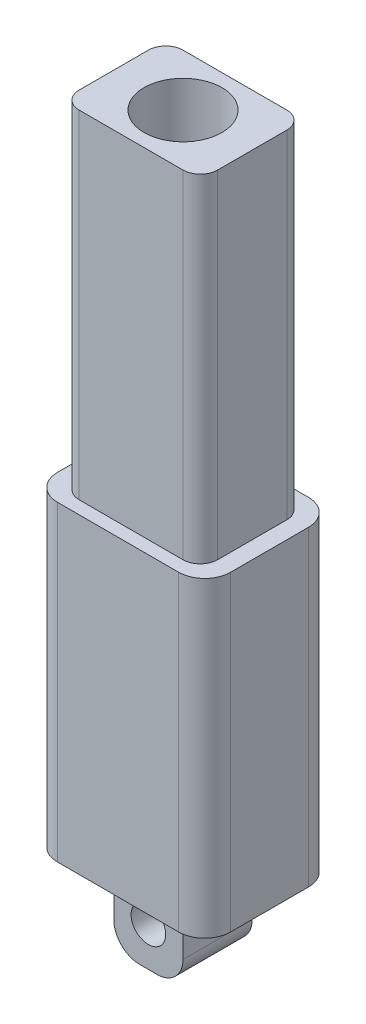
ISO-10303-21;
HEADER;
FILE_DESCRIPTION(('STEP AP214'),'2;1');
FILE_NAME('part.step','',(''),(''),'','','');
FILE_SCHEMA(('AUTOMOTIVE_DESIGN { 1 0 10303 214 1 1 1 1 }'));
ENDSEC;
DATA;
#1=APPLICATION_CONTEXT('core data for automotive mechanical design processes');
#2=APPLICATION_PROTOCOL_DEFINITION('international standard','automotive_design',2000,#1);
#3=PRODUCT_CONTEXT('',#1,'mechanical');
#4=PRODUCT('Part','Part','',(#3));
#5=PRODUCT_RELATED_PRODUCT_CATEGORY('part','',(#4));
#6=PRODUCT_DEFINITION_FORMATION('','',#4);
#7=PRODUCT_DEFINITION_CONTEXT('part definition',#1,'design');
#8=PRODUCT_DEFINITION('design','',#6,#7);
#9=PRODUCT_DEFINITION_SHAPE('','',#8);
#10=(LENGTH_UNIT() NAMED_UNIT(*) SI_UNIT(.MILLI.,.METRE.));
#11=(NAMED_UNIT(*) PLANE_ANGLE_UNIT() SI_UNIT($,.RADIAN.));
#12=(NAMED_UNIT(*) SI_UNIT($,.STERADIAN.) SOLID_ANGLE_UNIT());
#13=UNCERTAINTY_MEASURE_WITH_UNIT(LENGTH_MEASURE(1.E-05),#10,'distance_accuracy_value','');
#14=(GEOMETRIC_REPRESENTATION_CONTEXT(3) GLOBAL_UNCERTAINTY_ASSIGNED_CONTEXT((#13)) GLOBAL_UNIT_ASSIGNED_CONTEXT((#10,
#11,#12)) REPRESENTATION_CONTEXT('',''));
#15=CARTESIAN_POINT('',(0.,0.,0.));
#16=DIRECTION('',(0.,0.,1.));
#17=DIRECTION('',(1.,0.,0.));
#18=AXIS2_PLACEMENT_3D('',#15,#16,#17);
#19=CARTESIAN_POINT('',(8.,75.,6.));
#20=DIRECTION('',(-1.,0.,0.));
#21=DIRECTION('',(0.,-1.,0.));
#22=AXIS2_PLACEMENT_3D('',#19,#20,#21);
#23=PLANE('',#22);
#24=DIRECTION('',(0.,0.,-1.));
#25=VECTOR('',#24,1.);
#26=CARTESIAN_POINT('',(8.,36.,6.));
#27=LINE('',#26,#25);
#28=CARTESIAN_POINT('',(8.,36.,4.));
#29=VERTEX_POINT('',#28);
#30=CARTESIAN_POINT('',(8.,36.,-4.));
#31=VERTEX_POINT('',#30);
#32=EDGE_CURVE('E168',#29,#31,#27,.T.);
#33=ORIENTED_EDGE('',*,*,#32,.T.);
#34=DIRECTION('',(0.,1.,0.));
#35=VECTOR('',#34,1.);
#36=CARTESIAN_POINT('',(8.,75.,-4.));
#37=LINE('',#36,#35);
#38=CARTESIAN_POINT('',(8.,75.,-4.));
#39=VERTEX_POINT('',#38);
#40=EDGE_CURVE('E131',#31,#39,#37,.T.);
#41=ORIENTED_EDGE('',*,*,#40,.T.);
#42=DIRECTION('',(0.,0.,-1.));
#43=VECTOR('',#42,1.);
#44=CARTESIAN_POINT('',(8.,75.,6.));
#45=LINE('',#44,#43);
#46=CARTESIAN_POINT('',(8.,75.,4.));
#47=VERTEX_POINT('',#46);
#48=EDGE_CURVE('E116',#47,#39,#45,.T.);
#49=ORIENTED_EDGE('',*,*,#48,.F.);
#50=DIRECTION('',(0.,1.,0.));
#51=VECTOR('',#50,1.);
#52=CARTESIAN_POINT('',(8.,36.,4.));
#53=LINE('',#52,#51);
#54=EDGE_CURVE('E128',#47,#29,#53,.F.);
#55=ORIENTED_EDGE('',*,*,#54,.T.);
#56=EDGE_LOOP('',(#33,#41,#49,#55));
#57=FACE_BOUND('',#56,.T.);
#58=ADVANCED_FACE('F46',(#57),#23,.F.);
#59=CARTESIAN_POINT('',(-8.,75.,6.));
#60=DIRECTION('',(0.,-1.,0.));
#61=DIRECTION('',(0.,0.,-1.));
#62=AXIS2_PLACEMENT_3D('',#59,#60,#61);
#63=PLANE('',#62);
#64=CARTESIAN_POINT('',(0.,75.,0.));
#65=DIRECTION('',(0.,1.,0.));
#66=DIRECTION('',(0.,0.,1.));
#67=AXIS2_PLACEMENT_3D('',#64,#65,#66);
#68=CIRCLE('',#67,4.5);
#69=CARTESIAN_POINT('',(0.,75.,4.5));
#70=VERTEX_POINT('',#69);
#71=EDGE_CURVE('E289',#70,#70,#68,.T.);
#72=ORIENTED_EDGE('',*,*,#71,.F.);
#73=EDGE_LOOP('',(#72));
#74=FACE_BOUND('',#73,.T.);
#75=ORIENTED_EDGE('',*,*,#48,.T.);
#76=CARTESIAN_POINT('',(6.,75.,-4.));
#77=DIRECTION('',(0.,-1.,0.));
#78=DIRECTION('',(0.,0.,-1.));
#79=AXIS2_PLACEMENT_3D('',#76,#77,#78);
#80=CIRCLE('',#79,2.);
#81=CARTESIAN_POINT('',(6.,75.,-6.));
#82=VERTEX_POINT('',#81);
#83=EDGE_CURVE('E144',#39,#82,#80,.F.);
#84=ORIENTED_EDGE('',*,*,#83,.T.);
#85=DIRECTION('',(-1.,0.,0.));
#86=VECTOR('',#85,1.);
#87=CARTESIAN_POINT('',(-8.,75.,-6.));
#88=LINE('',#87,#86);
#89=CARTESIAN_POINT('',(-6.,75.,-6.));
#90=VERTEX_POINT('',#89);
#91=EDGE_CURVE('E176',#82,#90,#88,.T.);
#92=ORIENTED_EDGE('',*,*,#91,.T.);
#93=CARTESIAN_POINT('',(-6.,75.,-4.));
#94=DIRECTION('',(0.,-1.,0.));
#95=DIRECTION('',(0.,0.,-1.));
#96=AXIS2_PLACEMENT_3D('',#93,#94,#95);
#97=CIRCLE('',#96,2.);
#98=CARTESIAN_POINT('',(-8.,75.,-4.));
#99=VERTEX_POINT('',#98);
#100=EDGE_CURVE('E122',#90,#99,#97,.F.);
#101=ORIENTED_EDGE('',*,*,#100,.T.);
#102=DIRECTION('',(0.,0.,-1.));
#103=VECTOR('',#102,1.);
#104=CARTESIAN_POINT('',(-8.,75.,6.));
#105=LINE('',#104,#103);
#106=CARTESIAN_POINT('',(-8.,75.,4.));
#107=VERTEX_POINT('',#106);
#108=EDGE_CURVE('E132',#107,#99,#105,.T.);
#109=ORIENTED_EDGE('',*,*,#108,.F.);
#110=CARTESIAN_POINT('',(-6.,75.,4.));
#111=DIRECTION('',(0.,-1.,0.));
#112=DIRECTION('',(0.,0.,-1.));
#113=AXIS2_PLACEMENT_3D('',#110,#111,#112);
#114=CIRCLE('',#113,2.);
#115=CARTESIAN_POINT('',(-6.,75.,6.));
#116=VERTEX_POINT('',#115);
#117=EDGE_CURVE('E123',#107,#116,#114,.F.);
#118=ORIENTED_EDGE('',*,*,#117,.T.);
#119=DIRECTION('',(-1.,0.,0.));
#120=VECTOR('',#119,1.);
#121=CARTESIAN_POINT('',(-8.,75.,6.));
#122=LINE('',#121,#120);
#123=CARTESIAN_POINT('',(6.,75.,6.));
#124=VERTEX_POINT('',#123);
#125=EDGE_CURVE('E118',#124,#116,#122,.T.);
#126=ORIENTED_EDGE('',*,*,#125,.F.);
#127=CARTESIAN_POINT('',(6.,75.,4.));
#128=DIRECTION('',(0.,-1.,0.));
#129=DIRECTION('',(0.,0.,-1.));
#130=AXIS2_PLACEMENT_3D('',#127,#128,#129);
#131=CIRCLE('',#130,2.);
#132=EDGE_CURVE('E113',#124,#47,#131,.F.);
#133=ORIENTED_EDGE('',*,*,#132,.T.);
#134=EDGE_LOOP('',(#75,#84,#92,#101,#109,#118,#126,#133));
#135=FACE_BOUND('',#134,.T.);
#136=ADVANCED_FACE('F115',(#74,#135),#63,.F.);
#137=CARTESIAN_POINT('',(-8.,75.,6.));
#138=DIRECTION('',(1.,0.,0.));
#139=DIRECTION('',(0.,0.,-1.));
#140=AXIS2_PLACEMENT_3D('',#137,#138,#139);
#141=PLANE('',#140);
#142=ORIENTED_EDGE('',*,*,#108,.T.);
#143=DIRECTION('',(0.,-1.,0.));
#144=VECTOR('',#143,1.);
#145=CARTESIAN_POINT('',(-8.,75.,-4.));
#146=LINE('',#145,#144);
#147=CARTESIAN_POINT('',(-8.,36.,-4.));
#148=VERTEX_POINT('',#147);
#149=EDGE_CURVE('E157',#99,#148,#146,.T.);
#150=ORIENTED_EDGE('',*,*,#149,.T.);
#151=DIRECTION('',(0.,0.,-1.));
#152=VECTOR('',#151,1.);
#153=CARTESIAN_POINT('',(-8.,36.,6.));
#154=LINE('',#153,#152);
#155=CARTESIAN_POINT('',(-8.,36.,4.));
#156=VERTEX_POINT('',#155);
#157=EDGE_CURVE('E170',#156,#148,#154,.T.);
#158=ORIENTED_EDGE('',*,*,#157,.F.);
#159=DIRECTION('',(0.,-1.,0.));
#160=VECTOR('',#159,1.);
#161=CARTESIAN_POINT('',(-8.,75.,4.));
#162=LINE('',#161,#160);
#163=EDGE_CURVE('E155',#156,#107,#162,.F.);
#164=ORIENTED_EDGE('',*,*,#163,.T.);
#165=EDGE_LOOP('',(#142,#150,#158,#164));
#166=FACE_BOUND('',#165,.T.);
#167=ADVANCED_FACE('F184',(#166),#141,.F.);
#168=CARTESIAN_POINT('',(-8.,36.,6.));
#169=DIRECTION('',(0.,1.,0.));
#170=DIRECTION('',(0.,0.,1.));
#171=AXIS2_PLACEMENT_3D('',#168,#169,#170);
#172=PLANE('',#171);
#173=CARTESIAN_POINT('',(0.,36.,0.));
#174=DIRECTION('',(0.,1.,0.));
#175=DIRECTION('',(0.,0.,1.));
#176=AXIS2_PLACEMENT_3D('',#173,#174,#175);
#177=CIRCLE('',#176,4.5);
#178=CARTESIAN_POINT('',(0.,36.,4.5));
#179=VERTEX_POINT('',#178);
#180=EDGE_CURVE('E140',#179,#179,#177,.T.);
#181=ORIENTED_EDGE('',*,*,#180,.T.);
#182=EDGE_LOOP('',(#181));
#183=FACE_BOUND('',#182,.T.);
#184=DIRECTION('',(1.,0.,0.));
#185=VECTOR('',#184,1.);
#186=CARTESIAN_POINT('',(-8.,36.,-6.));
#187=LINE('',#186,#185);
#188=CARTESIAN_POINT('',(-6.,36.,-6.));
#189=VERTEX_POINT('',#188);
#190=CARTESIAN_POINT('',(6.,36.,-6.));
#191=VERTEX_POINT('',#190);
#192=EDGE_CURVE('E172',#189,#191,#187,.T.);
#193=ORIENTED_EDGE('',*,*,#192,.T.);
#194=CARTESIAN_POINT('',(6.,36.,-4.));
#195=DIRECTION('',(0.,1.,0.));
#196=DIRECTION('',(0.,0.,1.));
#197=AXIS2_PLACEMENT_3D('',#194,#195,#196);
#198=CIRCLE('',#197,2.);
#199=EDGE_CURVE('E153',#191,#31,#198,.F.);
#200=ORIENTED_EDGE('',*,*,#199,.T.);
#201=ORIENTED_EDGE('',*,*,#32,.F.);
#202=CARTESIAN_POINT('',(6.,36.,4.));
#203=DIRECTION('',(0.,1.,0.));
#204=DIRECTION('',(0.,0.,1.));
#205=AXIS2_PLACEMENT_3D('',#202,#203,#204);
#206=CIRCLE('',#205,2.);
#207=CARTESIAN_POINT('',(6.,36.,6.));
#208=VERTEX_POINT('',#207);
#209=EDGE_CURVE('E136',#29,#208,#206,.F.);
#210=ORIENTED_EDGE('',*,*,#209,.T.);
#211=DIRECTION('',(1.,0.,0.));
#212=VECTOR('',#211,1.);
#213=CARTESIAN_POINT('',(-8.,36.,6.));
#214=LINE('',#213,#212);
#215=CARTESIAN_POINT('',(-6.,36.,6.));
#216=VERTEX_POINT('',#215);
#217=EDGE_CURVE('E163',#216,#208,#214,.T.);
#218=ORIENTED_EDGE('',*,*,#217,.F.);
#219=CARTESIAN_POINT('',(-6.,36.,4.));
#220=DIRECTION('',(0.,1.,0.));
#221=DIRECTION('',(0.,0.,1.));
#222=AXIS2_PLACEMENT_3D('',#219,#220,#221);
#223=CIRCLE('',#222,2.);
#224=EDGE_CURVE('E69',#216,#156,#223,.F.);
#225=ORIENTED_EDGE('',*,*,#224,.T.);
#226=ORIENTED_EDGE('',*,*,#157,.T.);
#227=CARTESIAN_POINT('',(-6.,36.,-4.));
#228=DIRECTION('',(0.,1.,0.));
#229=DIRECTION('',(0.,0.,1.));
#230=AXIS2_PLACEMENT_3D('',#227,#228,#229);
#231=CIRCLE('',#230,2.);
#232=EDGE_CURVE('E61',#148,#189,#231,.F.);
#233=ORIENTED_EDGE('',*,*,#232,.T.);
#234=EDGE_LOOP('',(#193,#200,#201,#210,#218,#225,#226,#233));
#235=FACE_BOUND('',#234,.T.);
#236=ADVANCED_FACE('F167',(#183,#235),#172,.F.);
#237=CARTESIAN_POINT('',(0.,0.,6.));
#238=DIRECTION('',(0.,0.,1.));
#239=DIRECTION('',(1.,0.,0.));
#240=AXIS2_PLACEMENT_3D('',#237,#238,#239);
#241=PLANE('',#240);
#242=ORIENTED_EDGE('',*,*,#217,.T.);
#243=DIRECTION('',(0.,1.,0.));
#244=VECTOR('',#243,1.);
#245=CARTESIAN_POINT('',(6.,75.,6.));
#246=LINE('',#245,#244);
#247=EDGE_CURVE('E12',#208,#124,#246,.T.);
#248=ORIENTED_EDGE('',*,*,#247,.T.);
#249=ORIENTED_EDGE('',*,*,#125,.T.);
#250=DIRECTION('',(0.,-1.,0.));
#251=VECTOR('',#250,1.);
#252=CARTESIAN_POINT('',(-6.,36.,6.));
#253=LINE('',#252,#251);
#254=EDGE_CURVE('E54',#116,#216,#253,.T.);
#255=ORIENTED_EDGE('',*,*,#254,.T.);
#256=EDGE_LOOP('',(#242,#248,#249,#255));
#257=FACE_BOUND('',#256,.T.);
#258=ADVANCED_FACE('F162',(#257),#241,.T.);
#259=CARTESIAN_POINT('',(0.,0.,-6.));
#260=DIRECTION('',(0.,0.,1.));
#261=DIRECTION('',(1.,0.,0.));
#262=AXIS2_PLACEMENT_3D('',#259,#260,#261);
#263=PLANE('',#262);
#264=ORIENTED_EDGE('',*,*,#91,.F.);
#265=DIRECTION('',(0.,1.,0.));
#266=VECTOR('',#265,1.);
#267=CARTESIAN_POINT('',(6.,0.,-6.));
#268=LINE('',#267,#266);
#269=EDGE_CURVE('E148',#82,#191,#268,.F.);
#270=ORIENTED_EDGE('',*,*,#269,.T.);
#271=ORIENTED_EDGE('',*,*,#192,.F.);
#272=DIRECTION('',(0.,-1.,0.));
#273=VECTOR('',#272,1.);
#274=CARTESIAN_POINT('',(-6.,0.,-6.));
#275=LINE('',#274,#273);
#276=EDGE_CURVE('E146',#189,#90,#275,.F.);
#277=ORIENTED_EDGE('',*,*,#276,.T.);
#278=EDGE_LOOP('',(#264,#270,#271,#277));
#279=FACE_BOUND('',#278,.T.);
#280=ADVANCED_FACE('F191',(#279),#263,.F.);
#281=CARTESIAN_POINT('',(0.,35.,0.));
#282=DIRECTION('',(0.,1.,0.));
#283=DIRECTION('',(0.,0.,1.));
#284=AXIS2_PLACEMENT_3D('',#281,#282,#283);
#285=CYLINDRICAL_SURFACE('',#284,4.5);
#286=ORIENTED_EDGE('',*,*,#71,.T.);
#287=EDGE_LOOP('',(#286));
#288=FACE_BOUND('',#287,.T.);
#289=ORIENTED_EDGE('',*,*,#180,.F.);
#290=EDGE_LOOP('',(#289));
#291=FACE_BOUND('',#290,.T.);
#292=ADVANCED_FACE('F211',(#288,#291),#285,.F.);
#293=CARTESIAN_POINT('',(6.,75.,-4.));
#294=DIRECTION('',(0.,1.,0.));
#295=DIRECTION('',(-1.,0.,0.));
#296=AXIS2_PLACEMENT_3D('',#293,#294,#295);
#297=CYLINDRICAL_SURFACE('',#296,2.);
#298=ORIENTED_EDGE('',*,*,#199,.F.);
#299=ORIENTED_EDGE('',*,*,#269,.F.);
#300=ORIENTED_EDGE('',*,*,#83,.F.);
#301=ORIENTED_EDGE('',*,*,#40,.F.);
#302=EDGE_LOOP('',(#298,#299,#300,#301));
#303=FACE_BOUND('',#302,.T.);
#304=ADVANCED_FACE('F195',(#303),#297,.T.);
#305=CARTESIAN_POINT('',(-6.,75.,-4.));
#306=DIRECTION('',(0.,-1.,0.));
#307=DIRECTION('',(0.,0.,-1.));
#308=AXIS2_PLACEMENT_3D('',#305,#306,#307);
#309=CYLINDRICAL_SURFACE('',#308,2.);
#310=ORIENTED_EDGE('',*,*,#100,.F.);
#311=ORIENTED_EDGE('',*,*,#276,.F.);
#312=ORIENTED_EDGE('',*,*,#232,.F.);
#313=ORIENTED_EDGE('',*,*,#149,.F.);
#314=EDGE_LOOP('',(#310,#311,#312,#313));
#315=FACE_BOUND('',#314,.T.);
#316=ADVANCED_FACE('F187',(#315),#309,.T.);
#317=CARTESIAN_POINT('',(6.,0.,4.));
#318=DIRECTION('',(0.,-1.,0.));
#319=DIRECTION('',(1.,0.,0.));
#320=AXIS2_PLACEMENT_3D('',#317,#318,#319);
#321=CYLINDRICAL_SURFACE('',#320,2.);
#322=ORIENTED_EDGE('',*,*,#209,.F.);
#323=ORIENTED_EDGE('',*,*,#54,.F.);
#324=ORIENTED_EDGE('',*,*,#132,.F.);
#325=ORIENTED_EDGE('',*,*,#247,.F.);
#326=EDGE_LOOP('',(#322,#323,#324,#325));
#327=FACE_BOUND('',#326,.T.);
#328=ADVANCED_FACE('F135',(#327),#321,.T.);
#329=CARTESIAN_POINT('',(-6.,0.,4.));
#330=DIRECTION('',(0.,1.,0.));
#331=DIRECTION('',(0.,0.,1.));
#332=AXIS2_PLACEMENT_3D('',#329,#330,#331);
#333=CYLINDRICAL_SURFACE('',#332,2.);
#334=ORIENTED_EDGE('',*,*,#117,.F.);
#335=ORIENTED_EDGE('',*,*,#163,.F.);
#336=ORIENTED_EDGE('',*,*,#224,.F.);
#337=ORIENTED_EDGE('',*,*,#254,.F.);
#338=EDGE_LOOP('',(#334,#335,#336,#337));
#339=FACE_BOUND('',#338,.T.);
#340=ADVANCED_FACE('F48',(#339),#333,.T.);
#341=CLOSED_SHELL('',(#58,#136,#167,#236,#258,#280,#292,#304,#316,#328,#340));
#342=MANIFOLD_SOLID_BREP('B2',#341);
#343=CARTESIAN_POINT('',(0.,0.,0.));
#344=DIRECTION('',(0.,-1.,0.));
#345=DIRECTION('',(0.,0.,-1.));
#346=AXIS2_PLACEMENT_3D('',#343,#344,#345);
#347=PLANE('',#346);
#348=DIRECTION('',(0.,0.,-1.));
#349=VECTOR('',#348,1.);
#350=CARTESIAN_POINT('',(10.,0.,7.5));
#351=LINE('',#350,#349);
#352=CARTESIAN_POINT('',(10.,0.,4.5));
#353=VERTEX_POINT('',#352);
#354=CARTESIAN_POINT('',(10.,0.,-4.5));
#355=VERTEX_POINT('',#354);
#356=EDGE_CURVE('E491',#353,#355,#351,.T.);
#357=ORIENTED_EDGE('',*,*,#356,.F.);
#358=CARTESIAN_POINT('',(7.00000000000001,0.,4.5));
#359=DIRECTION('',(0.,-1.,0.));
#360=DIRECTION('',(0.,0.,-1.));
#361=AXIS2_PLACEMENT_3D('',#358,#359,#360);
#362=CIRCLE('',#361,3.);
#363=CARTESIAN_POINT('',(7.00000000000001,0.,7.5));
#364=VERTEX_POINT('',#363);
#365=EDGE_CURVE('E457',#353,#364,#362,.T.);
#366=ORIENTED_EDGE('',*,*,#365,.T.);
#367=DIRECTION('',(1.,0.,0.));
#368=VECTOR('',#367,1.);
#369=CARTESIAN_POINT('',(-9.99999999999999,0.,7.5));
#370=LINE('',#369,#368);
#371=CARTESIAN_POINT('',(-6.99999999999999,0.,7.5));
#372=VERTEX_POINT('',#371);
#373=EDGE_CURVE('E493',#372,#364,#370,.T.);
#374=ORIENTED_EDGE('',*,*,#373,.F.);
#375=CARTESIAN_POINT('',(-6.99999999999999,0.,4.5));
#376=DIRECTION('',(0.,-1.,0.));
#377=DIRECTION('',(0.,0.,-1.));
#378=AXIS2_PLACEMENT_3D('',#375,#376,#377);
#379=CIRCLE('',#378,3.);
#380=CARTESIAN_POINT('',(-9.99999999999999,0.,4.5));
#381=VERTEX_POINT('',#380);
#382=EDGE_CURVE('E451',#372,#381,#379,.T.);
#383=ORIENTED_EDGE('',*,*,#382,.T.);
#384=DIRECTION('',(0.,0.,1.));
#385=VECTOR('',#384,1.);
#386=CARTESIAN_POINT('',(-9.99999999999999,0.,7.5));
#387=LINE('',#386,#385);
#388=CARTESIAN_POINT('',(-9.99999999999999,0.,-4.5));
#389=VERTEX_POINT('',#388);
#390=EDGE_CURVE('E490',#389,#381,#387,.T.);
#391=ORIENTED_EDGE('',*,*,#390,.F.);
#392=CARTESIAN_POINT('',(-6.99999999999999,0.,-4.5));
#393=DIRECTION('',(0.,-1.,0.));
#394=DIRECTION('',(0.,0.,-1.));
#395=AXIS2_PLACEMENT_3D('',#392,#393,#394);
#396=CIRCLE('',#395,3.);
#397=CARTESIAN_POINT('',(-6.99999999999999,0.,-7.5));
#398=VERTEX_POINT('',#397);
#399=EDGE_CURVE('E453',#389,#398,#396,.T.);
#400=ORIENTED_EDGE('',*,*,#399,.T.);
#401=DIRECTION('',(-1.,0.,0.));
#402=VECTOR('',#401,1.);
#403=CARTESIAN_POINT('',(-9.99999999999999,0.,-7.5));
#404=LINE('',#403,#402);
#405=CARTESIAN_POINT('',(7.00000000000001,0.,-7.5));
#406=VERTEX_POINT('',#405);
#407=EDGE_CURVE('E481',#406,#398,#404,.T.);
#408=ORIENTED_EDGE('',*,*,#407,.F.);
#409=CARTESIAN_POINT('',(7.00000000000001,0.,-4.5));
#410=DIRECTION('',(0.,-1.,0.));
#411=DIRECTION('',(0.,0.,-1.));
#412=AXIS2_PLACEMENT_3D('',#409,#410,#411);
#413=CIRCLE('',#412,3.);
#414=EDGE_CURVE('E455',#406,#355,#413,.T.);
#415=ORIENTED_EDGE('',*,*,#414,.T.);
#416=EDGE_LOOP('',(#357,#366,#374,#383,#391,#400,#408,#415));
#417=FACE_BOUND('',#416,.T.);
#418=DIRECTION('',(0.,0.,-1.));
#419=VECTOR('',#418,1.);
#420=CARTESIAN_POINT('',(7.,0.,0.));
#421=LINE('',#420,#419);
#422=CARTESIAN_POINT('',(7.,0.,4.));
#423=VERTEX_POINT('',#422);
#424=CARTESIAN_POINT('',(7.,0.,-4.));
#425=VERTEX_POINT('',#424);
#426=EDGE_CURVE('E429',#423,#425,#421,.T.);
#427=ORIENTED_EDGE('',*,*,#426,.T.);
#428=DIRECTION('',(-1.,0.,0.));
#429=VECTOR('',#428,1.);
#430=CARTESIAN_POINT('',(-4.,0.,-4.));
#431=LINE('',#430,#429);
#432=CARTESIAN_POINT('',(-7.,0.,-4.));
#433=VERTEX_POINT('',#432);
#434=EDGE_CURVE('E426',#425,#433,#431,.T.);
#435=ORIENTED_EDGE('',*,*,#434,.T.);
#436=DIRECTION('',(0.,0.,-1.));
#437=VECTOR('',#436,1.);
#438=CARTESIAN_POINT('',(-7.,0.,0.));
#439=LINE('',#438,#437);
#440=CARTESIAN_POINT('',(-7.,0.,4.));
#441=VERTEX_POINT('',#440);
#442=EDGE_CURVE('E425',#433,#441,#439,.F.);
#443=ORIENTED_EDGE('',*,*,#442,.T.);
#444=DIRECTION('',(-1.,0.,0.));
#445=VECTOR('',#444,1.);
#446=CARTESIAN_POINT('',(-4.,0.,4.));
#447=LINE('',#446,#445);
#448=EDGE_CURVE('E407',#423,#441,#447,.T.);
#449=ORIENTED_EDGE('',*,*,#448,.F.);
#450=EDGE_LOOP('',(#427,#435,#443,#449));
#451=FACE_BOUND('',#450,.T.);
#452=ADVANCED_FACE('F294',(#417,#451),#347,.T.);
#453=CARTESIAN_POINT('',(10.,36.,7.5));
#454=DIRECTION('',(-1.,0.,0.));
#455=DIRECTION('',(0.,0.,1.));
#456=AXIS2_PLACEMENT_3D('',#453,#454,#455);
#457=PLANE('',#456);
#458=DIRECTION('',(0.,0.,-1.));
#459=VECTOR('',#458,1.);
#460=CARTESIAN_POINT('',(10.,36.,7.5));
#461=LINE('',#460,#459);
#462=CARTESIAN_POINT('',(10.,36.,4.5));
#463=VERTEX_POINT('',#462);
#464=CARTESIAN_POINT('',(10.,36.,-4.5));
#465=VERTEX_POINT('',#464);
#466=EDGE_CURVE('E500',#463,#465,#461,.T.);
#467=ORIENTED_EDGE('',*,*,#466,.F.);
#468=DIRECTION('',(0.,-1.,0.));
#469=VECTOR('',#468,1.);
#470=CARTESIAN_POINT('',(10.,36.,4.5));
#471=LINE('',#470,#469);
#472=EDGE_CURVE('E439',#463,#353,#471,.T.);
#473=ORIENTED_EDGE('',*,*,#472,.T.);
#474=ORIENTED_EDGE('',*,*,#356,.T.);
#475=DIRECTION('',(0.,-1.,0.));
#476=VECTOR('',#475,1.);
#477=CARTESIAN_POINT('',(10.,36.,-4.5));
#478=LINE('',#477,#476);
#479=EDGE_CURVE('E436',#355,#465,#478,.F.);
#480=ORIENTED_EDGE('',*,*,#479,.T.);
#481=EDGE_LOOP('',(#467,#473,#474,#480));
#482=FACE_BOUND('',#481,.T.);
#483=ADVANCED_FACE('F554',(#482),#457,.F.);
#484=CARTESIAN_POINT('',(-9.99999999999999,36.,-7.5));
#485=DIRECTION('',(0.,0.,1.));
#486=DIRECTION('',(1.,0.,0.));
#487=AXIS2_PLACEMENT_3D('',#484,#485,#486);
#488=PLANE('',#487);
#489=DIRECTION('',(-1.,0.,0.));
#490=VECTOR('',#489,1.);
#491=CARTESIAN_POINT('',(-9.99999999999999,36.,-7.5));
#492=LINE('',#491,#490);
#493=CARTESIAN_POINT('',(7.00000000000001,36.,-7.5));
#494=VERTEX_POINT('',#493);
#495=CARTESIAN_POINT('',(-6.99999999999999,36.,-7.5));
#496=VERTEX_POINT('',#495);
#497=EDGE_CURVE('E483',#494,#496,#492,.T.);
#498=ORIENTED_EDGE('',*,*,#497,.F.);
#499=DIRECTION('',(0.,-1.,0.));
#500=VECTOR('',#499,1.);
#501=CARTESIAN_POINT('',(7.00000000000001,36.,-7.5));
#502=LINE('',#501,#500);
#503=EDGE_CURVE('E473',#494,#406,#502,.T.);
#504=ORIENTED_EDGE('',*,*,#503,.T.);
#505=ORIENTED_EDGE('',*,*,#407,.T.);
#506=DIRECTION('',(0.,-1.,0.));
#507=VECTOR('',#506,1.);
#508=CARTESIAN_POINT('',(-6.99999999999999,36.,-7.5));
#509=LINE('',#508,#507);
#510=EDGE_CURVE('E471',#398,#496,#509,.F.);
#511=ORIENTED_EDGE('',*,*,#510,.T.);
#512=EDGE_LOOP('',(#498,#504,#505,#511));
#513=FACE_BOUND('',#512,.T.);
#514=ADVANCED_FACE('F480',(#513),#488,.F.);
#515=CARTESIAN_POINT('',(-9.99999999999999,36.,7.5));
#516=DIRECTION('',(1.,0.,0.));
#517=DIRECTION('',(0.,0.,-1.));
#518=AXIS2_PLACEMENT_3D('',#515,#516,#517);
#519=PLANE('',#518);
#520=DIRECTION('',(0.,0.,1.));
#521=VECTOR('',#520,1.);
#522=CARTESIAN_POINT('',(-9.99999999999999,36.,7.5));
#523=LINE('',#522,#521);
#524=CARTESIAN_POINT('',(-9.99999999999999,36.,-4.5));
#525=VERTEX_POINT('',#524);
#526=CARTESIAN_POINT('',(-9.99999999999999,36.,4.5));
#527=VERTEX_POINT('',#526);
#528=EDGE_CURVE('E723',#525,#527,#523,.T.);
#529=ORIENTED_EDGE('',*,*,#528,.F.);
#530=DIRECTION('',(0.,-1.,0.));
#531=VECTOR('',#530,1.);
#532=CARTESIAN_POINT('',(-9.99999999999999,36.,-4.5));
#533=LINE('',#532,#531);
#534=EDGE_CURVE('E44',#525,#389,#533,.T.);
#535=ORIENTED_EDGE('',*,*,#534,.T.);
#536=ORIENTED_EDGE('',*,*,#390,.T.);
#537=DIRECTION('',(0.,-1.,0.));
#538=VECTOR('',#537,1.);
#539=CARTESIAN_POINT('',(-9.99999999999999,36.,4.5));
#540=LINE('',#539,#538);
#541=EDGE_CURVE('E302',#381,#527,#540,.F.);
#542=ORIENTED_EDGE('',*,*,#541,.T.);
#543=EDGE_LOOP('',(#529,#535,#536,#542));
#544=FACE_BOUND('',#543,.T.);
#545=ADVANCED_FACE('F567',(#544),#519,.F.);
#546=CARTESIAN_POINT('',(-9.99999999999999,36.,7.5));
#547=DIRECTION('',(0.,0.,-1.));
#548=DIRECTION('',(-1.,0.,0.));
#549=AXIS2_PLACEMENT_3D('',#546,#547,#548);
#550=PLANE('',#549);
#551=ORIENTED_EDGE('',*,*,#373,.T.);
#552=DIRECTION('',(0.,-1.,0.));
#553=VECTOR('',#552,1.);
#554=CARTESIAN_POINT('',(7.00000000000001,36.,7.5));
#555=LINE('',#554,#553);
#556=CARTESIAN_POINT('',(7.00000000000001,36.,7.5));
#557=VERTEX_POINT('',#556);
#558=EDGE_CURVE('E462',#364,#557,#555,.F.);
#559=ORIENTED_EDGE('',*,*,#558,.T.);
#560=DIRECTION('',(1.,0.,0.));
#561=VECTOR('',#560,1.);
#562=CARTESIAN_POINT('',(-9.99999999999999,36.,7.5));
#563=LINE('',#562,#561);
#564=CARTESIAN_POINT('',(-6.99999999999999,36.,7.5));
#565=VERTEX_POINT('',#564);
#566=EDGE_CURVE('E430',#565,#557,#563,.T.);
#567=ORIENTED_EDGE('',*,*,#566,.F.);
#568=DIRECTION('',(0.,-1.,0.));
#569=VECTOR('',#568,1.);
#570=CARTESIAN_POINT('',(-6.99999999999999,36.,7.5));
#571=LINE('',#570,#569);
#572=EDGE_CURVE('E459',#565,#372,#571,.T.);
#573=ORIENTED_EDGE('',*,*,#572,.T.);
#574=EDGE_LOOP('',(#551,#559,#567,#573));
#575=FACE_BOUND('',#574,.T.);
#576=ADVANCED_FACE('F564',(#575),#550,.F.);
#577=CARTESIAN_POINT('',(0.,36.,0.));
#578=DIRECTION('',(0.,-1.,0.));
#579=DIRECTION('',(0.,0.,-1.));
#580=AXIS2_PLACEMENT_3D('',#577,#578,#579);
#581=PLANE('',#580);
#582=CARTESIAN_POINT('',(0.,36.,0.));
#583=DIRECTION('',(0.,-1.,0.));
#584=DIRECTION('',(0.,0.,-1.));
#585=AXIS2_PLACEMENT_3D('',#582,#583,#584);
#586=CIRCLE('',#585,4.5);
#587=CARTESIAN_POINT('',(0.,36.,-4.5));
#588=VERTEX_POINT('',#587);
#589=EDGE_CURVE('E444',#588,#588,#586,.T.);
#590=ORIENTED_EDGE('',*,*,#589,.T.);
#591=EDGE_LOOP('',(#590));
#592=FACE_BOUND('',#591,.T.);
#593=ORIENTED_EDGE('',*,*,#566,.T.);
#594=CARTESIAN_POINT('',(7.00000000000001,36.,4.5));
#595=DIRECTION('',(0.,-1.,0.));
#596=DIRECTION('',(0.,0.,-1.));
#597=AXIS2_PLACEMENT_3D('',#594,#595,#596);
#598=CIRCLE('',#597,3.);
#599=EDGE_CURVE('E469',#557,#463,#598,.F.);
#600=ORIENTED_EDGE('',*,*,#599,.T.);
#601=ORIENTED_EDGE('',*,*,#466,.T.);
#602=CARTESIAN_POINT('',(7.00000000000001,36.,-4.5));
#603=DIRECTION('',(0.,-1.,0.));
#604=DIRECTION('',(0.,0.,-1.));
#605=AXIS2_PLACEMENT_3D('',#602,#603,#604);
#606=CIRCLE('',#605,3.);
#607=EDGE_CURVE('E467',#465,#494,#606,.F.);
#608=ORIENTED_EDGE('',*,*,#607,.T.);
#609=ORIENTED_EDGE('',*,*,#497,.T.);
#610=CARTESIAN_POINT('',(-6.99999999999999,36.,-4.5));
#611=DIRECTION('',(0.,-1.,0.));
#612=DIRECTION('',(0.,0.,-1.));
#613=AXIS2_PLACEMENT_3D('',#610,#611,#612);
#614=CIRCLE('',#613,3.);
#615=EDGE_CURVE('E315',#496,#525,#614,.F.);
#616=ORIENTED_EDGE('',*,*,#615,.T.);
#617=ORIENTED_EDGE('',*,*,#528,.T.);
#618=CARTESIAN_POINT('',(-6.99999999999999,36.,4.5));
#619=DIRECTION('',(0.,-1.,0.));
#620=DIRECTION('',(0.,0.,-1.));
#621=AXIS2_PLACEMENT_3D('',#618,#619,#620);
#622=CIRCLE('',#621,3.);
#623=EDGE_CURVE('E464',#527,#565,#622,.F.);
#624=ORIENTED_EDGE('',*,*,#623,.T.);
#625=EDGE_LOOP('',(#593,#600,#601,#608,#609,#616,#617,#624));
#626=FACE_BOUND('',#625,.T.);
#627=ADVANCED_FACE('F562',(#592,#626),#581,.F.);
#628=CARTESIAN_POINT('',(0.,0.,4.));
#629=DIRECTION('',(0.,0.,-1.));
#630=DIRECTION('',(-1.,0.,0.));
#631=AXIS2_PLACEMENT_3D('',#628,#629,#630);
#632=PLANE('',#631);
#633=DIRECTION('',(0.,-1.,0.));
#634=VECTOR('',#633,1.);
#635=CARTESIAN_POINT('',(-4.,0.,4.));
#636=LINE('',#635,#634);
#637=CARTESIAN_POINT('',(-4.,-3.,4.));
#638=VERTEX_POINT('',#637);
#639=CARTESIAN_POINT('',(-4.,-6.,4.));
#640=VERTEX_POINT('',#639);
#641=EDGE_CURVE('E421',#638,#640,#636,.T.);
#642=ORIENTED_EDGE('',*,*,#641,.T.);
#643=CARTESIAN_POINT('',(-0.999999999999999,-6.,4.));
#644=DIRECTION('',(0.,0.,-1.));
#645=DIRECTION('',(-1.,0.,0.));
#646=AXIS2_PLACEMENT_3D('',#643,#644,#645);
#647=CIRCLE('',#646,3.);
#648=CARTESIAN_POINT('',(-0.999999999999998,-9.,4.));
#649=VERTEX_POINT('',#648);
#650=EDGE_CURVE('E522',#640,#649,#647,.F.);
#651=ORIENTED_EDGE('',*,*,#650,.T.);
#652=DIRECTION('',(1.,0.,0.));
#653=VECTOR('',#652,1.);
#654=CARTESIAN_POINT('',(4.,-9.,4.));
#655=LINE('',#654,#653);
#656=CARTESIAN_POINT('',(1.,-9.,4.));
#657=VERTEX_POINT('',#656);
#658=EDGE_CURVE('E739',#649,#657,#655,.T.);
#659=ORIENTED_EDGE('',*,*,#658,.T.);
#660=CARTESIAN_POINT('',(1.,-6.,4.));
#661=DIRECTION('',(0.,0.,-1.));
#662=DIRECTION('',(-1.,0.,0.));
#663=AXIS2_PLACEMENT_3D('',#660,#661,#662);
#664=CIRCLE('',#663,3.);
#665=CARTESIAN_POINT('',(4.,-6.,4.));
#666=VERTEX_POINT('',#665);
#667=EDGE_CURVE('E520',#657,#666,#664,.F.);
#668=ORIENTED_EDGE('',*,*,#667,.T.);
#669=DIRECTION('',(0.,1.,0.));
#670=VECTOR('',#669,1.);
#671=CARTESIAN_POINT('',(4.,0.,4.));
#672=LINE('',#671,#670);
#673=CARTESIAN_POINT('',(4.,-3.,4.));
#674=VERTEX_POINT('',#673);
#675=EDGE_CURVE('E495',#666,#674,#672,.T.);
#676=ORIENTED_EDGE('',*,*,#675,.T.);
#677=CARTESIAN_POINT('',(7.,-3.,4.));
#678=DIRECTION('',(0.,0.,-1.));
#679=DIRECTION('',(-1.,0.,0.));
#680=AXIS2_PLACEMENT_3D('',#677,#678,#679);
#681=CIRCLE('',#680,3.);
#682=EDGE_CURVE('E417',#674,#423,#681,.T.);
#683=ORIENTED_EDGE('',*,*,#682,.T.);
#684=ORIENTED_EDGE('',*,*,#448,.T.);
#685=CARTESIAN_POINT('',(-7.,-3.,4.));
#686=DIRECTION('',(0.,0.,-1.));
#687=DIRECTION('',(-1.,0.,0.));
#688=AXIS2_PLACEMENT_3D('',#685,#686,#687);
#689=CIRCLE('',#688,3.);
#690=EDGE_CURVE('E413',#441,#638,#689,.T.);
#691=ORIENTED_EDGE('',*,*,#690,.T.);
#692=EDGE_LOOP('',(#642,#651,#659,#668,#676,#683,#684,#691));
#693=FACE_BOUND('',#692,.T.);
#694=CARTESIAN_POINT('',(0.,-4.5,4.));
#695=DIRECTION('',(0.,0.,1.));
#696=DIRECTION('',(1.,0.,0.));
#697=AXIS2_PLACEMENT_3D('',#694,#695,#696);
#698=CIRCLE('',#697,2.);
#699=CARTESIAN_POINT('',(2.,-4.5,4.));
#700=VERTEX_POINT('',#699);
#701=EDGE_CURVE('E737',#700,#700,#698,.T.);
#702=ORIENTED_EDGE('',*,*,#701,.F.);
#703=EDGE_LOOP('',(#702));
#704=FACE_BOUND('',#703,.T.);
#705=ADVANCED_FACE('F410',(#693,#704),#632,.F.);
#706=CARTESIAN_POINT('',(0.,0.,-4.));
#707=DIRECTION('',(0.,0.,-1.));
#708=DIRECTION('',(-1.,0.,0.));
#709=AXIS2_PLACEMENT_3D('',#706,#707,#708);
#710=PLANE('',#709);
#711=DIRECTION('',(1.,0.,0.));
#712=VECTOR('',#711,1.);
#713=CARTESIAN_POINT('',(4.,-9.,-4.));
#714=LINE('',#713,#712);
#715=CARTESIAN_POINT('',(-0.999999999999998,-9.,-4.));
#716=VERTEX_POINT('',#715);
#717=CARTESIAN_POINT('',(1.,-9.,-4.));
#718=VERTEX_POINT('',#717);
#719=EDGE_CURVE('E538',#716,#718,#714,.T.);
#720=ORIENTED_EDGE('',*,*,#719,.F.);
#721=CARTESIAN_POINT('',(-0.999999999999999,-6.,-4.));
#722=DIRECTION('',(0.,0.,-1.));
#723=DIRECTION('',(-1.,0.,0.));
#724=AXIS2_PLACEMENT_3D('',#721,#722,#723);
#725=CIRCLE('',#724,3.);
#726=CARTESIAN_POINT('',(-4.,-6.,-4.));
#727=VERTEX_POINT('',#726);
#728=EDGE_CURVE('E518',#716,#727,#725,.T.);
#729=ORIENTED_EDGE('',*,*,#728,.T.);
#730=DIRECTION('',(0.,-1.,0.));
#731=VECTOR('',#730,1.);
#732=CARTESIAN_POINT('',(-4.,0.,-4.));
#733=LINE('',#732,#731);
#734=CARTESIAN_POINT('',(-4.,-3.,-4.));
#735=VERTEX_POINT('',#734);
#736=EDGE_CURVE('E733',#735,#727,#733,.T.);
#737=ORIENTED_EDGE('',*,*,#736,.F.);
#738=CARTESIAN_POINT('',(-7.,-3.,-4.));
#739=DIRECTION('',(0.,0.,-1.));
#740=DIRECTION('',(-1.,0.,0.));
#741=AXIS2_PLACEMENT_3D('',#738,#739,#740);
#742=CIRCLE('',#741,3.);
#743=EDGE_CURVE('E437',#735,#433,#742,.F.);
#744=ORIENTED_EDGE('',*,*,#743,.T.);
#745=ORIENTED_EDGE('',*,*,#434,.F.);
#746=CARTESIAN_POINT('',(7.,-3.,-4.));
#747=DIRECTION('',(0.,0.,-1.));
#748=DIRECTION('',(-1.,0.,0.));
#749=AXIS2_PLACEMENT_3D('',#746,#747,#748);
#750=CIRCLE('',#749,3.);
#751=CARTESIAN_POINT('',(4.,-3.,-4.));
#752=VERTEX_POINT('',#751);
#753=EDGE_CURVE('E524',#425,#752,#750,.F.);
#754=ORIENTED_EDGE('',*,*,#753,.T.);
#755=DIRECTION('',(0.,1.,0.));
#756=VECTOR('',#755,1.);
#757=CARTESIAN_POINT('',(4.,0.,-4.));
#758=LINE('',#757,#756);
#759=CARTESIAN_POINT('',(4.,-6.,-4.));
#760=VERTEX_POINT('',#759);
#761=EDGE_CURVE('E422',#760,#752,#758,.T.);
#762=ORIENTED_EDGE('',*,*,#761,.F.);
#763=CARTESIAN_POINT('',(1.,-6.,-4.));
#764=DIRECTION('',(0.,0.,-1.));
#765=DIRECTION('',(-1.,0.,0.));
#766=AXIS2_PLACEMENT_3D('',#763,#764,#765);
#767=CIRCLE('',#766,3.);
#768=EDGE_CURVE('E516',#760,#718,#767,.T.);
#769=ORIENTED_EDGE('',*,*,#768,.T.);
#770=EDGE_LOOP('',(#720,#729,#737,#744,#745,#754,#762,#769));
#771=FACE_BOUND('',#770,.T.);
#772=CARTESIAN_POINT('',(0.,-4.5,-4.));
#773=DIRECTION('',(0.,0.,1.));
#774=DIRECTION('',(1.,0.,0.));
#775=AXIS2_PLACEMENT_3D('',#772,#773,#774);
#776=CIRCLE('',#775,2.);
#777=CARTESIAN_POINT('',(2.,-4.5,-4.));
#778=VERTEX_POINT('',#777);
#779=EDGE_CURVE('E446',#778,#778,#776,.T.);
#780=ORIENTED_EDGE('',*,*,#779,.T.);
#781=EDGE_LOOP('',(#780));
#782=FACE_BOUND('',#781,.T.);
#783=ADVANCED_FACE('F530',(#771,#782),#710,.T.);
#784=CARTESIAN_POINT('',(-4.,0.,4.));
#785=DIRECTION('',(1.,0.,0.));
#786=DIRECTION('',(0.,1.,0.));
#787=AXIS2_PLACEMENT_3D('',#784,#785,#786);
#788=PLANE('',#787);
#789=ORIENTED_EDGE('',*,*,#641,.F.);
#790=DIRECTION('',(0.,0.,-1.));
#791=VECTOR('',#790,1.);
#792=CARTESIAN_POINT('',(-4.,-3.,4.));
#793=LINE('',#792,#791);
#794=EDGE_CURVE('E435',#638,#735,#793,.T.);
#795=ORIENTED_EDGE('',*,*,#794,.T.);
#796=ORIENTED_EDGE('',*,*,#736,.T.);
#797=DIRECTION('',(0.,0.,-1.));
#798=VECTOR('',#797,1.);
#799=CARTESIAN_POINT('',(-4.,-6.,4.));
#800=LINE('',#799,#798);
#801=EDGE_CURVE('E508',#727,#640,#800,.F.);
#802=ORIENTED_EDGE('',*,*,#801,.T.);
#803=EDGE_LOOP('',(#789,#795,#796,#802));
#804=FACE_BOUND('',#803,.T.);
#805=ADVANCED_FACE('F604',(#804),#788,.F.);
#806=CARTESIAN_POINT('',(4.,-9.,4.));
#807=DIRECTION('',(0.,1.,0.));
#808=DIRECTION('',(-1.,0.,0.));
#809=AXIS2_PLACEMENT_3D('',#806,#807,#808);
#810=PLANE('',#809);
#811=ORIENTED_EDGE('',*,*,#658,.F.);
#812=DIRECTION('',(0.,0.,-1.));
#813=VECTOR('',#812,1.);
#814=CARTESIAN_POINT('',(-0.999999999999998,-9.,4.));
#815=LINE('',#814,#813);
#816=EDGE_CURVE('E513',#649,#716,#815,.T.);
#817=ORIENTED_EDGE('',*,*,#816,.T.);
#818=ORIENTED_EDGE('',*,*,#719,.T.);
#819=DIRECTION('',(0.,0.,-1.));
#820=VECTOR('',#819,1.);
#821=CARTESIAN_POINT('',(1.,-9.,4.));
#822=LINE('',#821,#820);
#823=EDGE_CURVE('E511',#718,#657,#822,.F.);
#824=ORIENTED_EDGE('',*,*,#823,.T.);
#825=EDGE_LOOP('',(#811,#817,#818,#824));
#826=FACE_BOUND('',#825,.T.);
#827=ADVANCED_FACE('F611',(#826),#810,.F.);
#828=CARTESIAN_POINT('',(4.,0.,4.));
#829=DIRECTION('',(-1.,0.,0.));
#830=DIRECTION('',(0.,-1.,0.));
#831=AXIS2_PLACEMENT_3D('',#828,#829,#830);
#832=PLANE('',#831);
#833=ORIENTED_EDGE('',*,*,#761,.T.);
#834=DIRECTION('',(0.,0.,-1.));
#835=VECTOR('',#834,1.);
#836=CARTESIAN_POINT('',(4.,-3.,4.));
#837=LINE('',#836,#835);
#838=EDGE_CURVE('E506',#752,#674,#837,.F.);
#839=ORIENTED_EDGE('',*,*,#838,.T.);
#840=ORIENTED_EDGE('',*,*,#675,.F.);
#841=DIRECTION('',(0.,0.,-1.));
#842=VECTOR('',#841,1.);
#843=CARTESIAN_POINT('',(4.,-6.,4.));
#844=LINE('',#843,#842);
#845=EDGE_CURVE('E503',#666,#760,#844,.T.);
#846=ORIENTED_EDGE('',*,*,#845,.T.);
#847=EDGE_LOOP('',(#833,#839,#840,#846));
#848=FACE_BOUND('',#847,.T.);
#849=ADVANCED_FACE('F535',(#848),#832,.F.);
#850=CARTESIAN_POINT('',(0.,-4.5,4.));
#851=DIRECTION('',(0.,0.,-1.));
#852=DIRECTION('',(-1.,0.,0.));
#853=AXIS2_PLACEMENT_3D('',#850,#851,#852);
#854=CYLINDRICAL_SURFACE('',#853,2.);
#855=ORIENTED_EDGE('',*,*,#701,.T.);
#856=EDGE_LOOP('',(#855));
#857=FACE_BOUND('',#856,.T.);
#858=ORIENTED_EDGE('',*,*,#779,.F.);
#859=EDGE_LOOP('',(#858));
#860=FACE_BOUND('',#859,.T.);
#861=ADVANCED_FACE('F542',(#857,#860),#854,.F.);
#862=CARTESIAN_POINT('',(7.,-3.,0.));
#863=DIRECTION('',(0.,0.,-1.));
#864=DIRECTION('',(-1.,0.,0.));
#865=AXIS2_PLACEMENT_3D('',#862,#863,#864);
#866=CYLINDRICAL_SURFACE('',#865,3.);
#867=ORIENTED_EDGE('',*,*,#682,.F.);
#868=ORIENTED_EDGE('',*,*,#838,.F.);
#869=ORIENTED_EDGE('',*,*,#753,.F.);
#870=ORIENTED_EDGE('',*,*,#426,.F.);
#871=EDGE_LOOP('',(#867,#868,#869,#870));
#872=FACE_BOUND('',#871,.T.);
#873=ADVANCED_FACE('F540',(#872),#866,.F.);
#874=CARTESIAN_POINT('',(-7.,-3.,4.));
#875=DIRECTION('',(0.,0.,-1.));
#876=DIRECTION('',(-1.,0.,0.));
#877=AXIS2_PLACEMENT_3D('',#874,#875,#876);
#878=CYLINDRICAL_SURFACE('',#877,3.);
#879=ORIENTED_EDGE('',*,*,#690,.F.);
#880=ORIENTED_EDGE('',*,*,#442,.F.);
#881=ORIENTED_EDGE('',*,*,#743,.F.);
#882=ORIENTED_EDGE('',*,*,#794,.F.);
#883=EDGE_LOOP('',(#879,#880,#881,#882));
#884=FACE_BOUND('',#883,.T.);
#885=ADVANCED_FACE('F433',(#884),#878,.F.);
#886=CARTESIAN_POINT('',(-0.999999999999999,-6.,4.));
#887=DIRECTION('',(0.,0.,-1.));
#888=DIRECTION('',(-1.,0.,0.));
#889=AXIS2_PLACEMENT_3D('',#886,#887,#888);
#890=CYLINDRICAL_SURFACE('',#889,3.);
#891=ORIENTED_EDGE('',*,*,#650,.F.);
#892=ORIENTED_EDGE('',*,*,#801,.F.);
#893=ORIENTED_EDGE('',*,*,#728,.F.);
#894=ORIENTED_EDGE('',*,*,#816,.F.);
#895=EDGE_LOOP('',(#891,#892,#893,#894));
#896=FACE_BOUND('',#895,.T.);
#897=ADVANCED_FACE('F548',(#896),#890,.T.);
#898=CARTESIAN_POINT('',(1.,-6.,4.));
#899=DIRECTION('',(0.,0.,-1.));
#900=DIRECTION('',(-1.,0.,0.));
#901=AXIS2_PLACEMENT_3D('',#898,#899,#900);
#902=CYLINDRICAL_SURFACE('',#901,3.);
#903=ORIENTED_EDGE('',*,*,#667,.F.);
#904=ORIENTED_EDGE('',*,*,#823,.F.);
#905=ORIENTED_EDGE('',*,*,#768,.F.);
#906=ORIENTED_EDGE('',*,*,#845,.F.);
#907=EDGE_LOOP('',(#903,#904,#905,#906));
#908=FACE_BOUND('',#907,.T.);
#909=ADVANCED_FACE('F649',(#908),#902,.T.);
#910=CARTESIAN_POINT('',(0.,35.,0.));
#911=DIRECTION('',(0.,1.,0.));
#912=DIRECTION('',(0.,0.,1.));
#913=AXIS2_PLACEMENT_3D('',#910,#911,#912);
#914=CYLINDRICAL_SURFACE('',#913,4.5);
#915=CARTESIAN_POINT('',(0.,35.,0.));
#916=DIRECTION('',(0.,1.,0.));
#917=DIRECTION('',(0.,0.,1.));
#918=AXIS2_PLACEMENT_3D('',#915,#916,#917);
#919=CIRCLE('',#918,4.5);
#920=CARTESIAN_POINT('',(0.,35.,4.5));
#921=VERTEX_POINT('',#920);
#922=EDGE_CURVE('E447',#921,#921,#919,.T.);
#923=ORIENTED_EDGE('',*,*,#922,.F.);
#924=EDGE_LOOP('',(#923));
#925=FACE_BOUND('',#924,.T.);
#926=ORIENTED_EDGE('',*,*,#589,.F.);
#927=EDGE_LOOP('',(#926));
#928=FACE_BOUND('',#927,.T.);
#929=ADVANCED_FACE('F658',(#925,#928),#914,.F.);
#930=CARTESIAN_POINT('',(0.,35.,0.));
#931=DIRECTION('',(0.,1.,0.));
#932=DIRECTION('',(0.,0.,1.));
#933=AXIS2_PLACEMENT_3D('',#930,#931,#932);
#934=PLANE('',#933);
#935=ORIENTED_EDGE('',*,*,#922,.T.);
#936=EDGE_LOOP('',(#935));
#937=FACE_BOUND('',#936,.T.);
#938=ADVANCED_FACE('F667',(#937),#934,.T.);
#939=CARTESIAN_POINT('',(7.00000000000001,36.,4.5));
#940=DIRECTION('',(0.,-1.,0.));
#941=DIRECTION('',(0.,0.,-1.));
#942=AXIS2_PLACEMENT_3D('',#939,#940,#941);
#943=CYLINDRICAL_SURFACE('',#942,3.);
#944=ORIENTED_EDGE('',*,*,#599,.F.);
#945=ORIENTED_EDGE('',*,*,#558,.F.);
#946=ORIENTED_EDGE('',*,*,#365,.F.);
#947=ORIENTED_EDGE('',*,*,#472,.F.);
#948=EDGE_LOOP('',(#944,#945,#946,#947));
#949=FACE_BOUND('',#948,.T.);
#950=ADVANCED_FACE('F676',(#949),#943,.T.);
#951=CARTESIAN_POINT('',(7.00000000000001,36.,-4.5));
#952=DIRECTION('',(0.,-1.,0.));
#953=DIRECTION('',(0.,0.,-1.));
#954=AXIS2_PLACEMENT_3D('',#951,#952,#953);
#955=CYLINDRICAL_SURFACE('',#954,3.);
#956=ORIENTED_EDGE('',*,*,#607,.F.);
#957=ORIENTED_EDGE('',*,*,#479,.F.);
#958=ORIENTED_EDGE('',*,*,#414,.F.);
#959=ORIENTED_EDGE('',*,*,#503,.F.);
#960=EDGE_LOOP('',(#956,#957,#958,#959));
#961=FACE_BOUND('',#960,.T.);
#962=ADVANCED_FACE('F684',(#961),#955,.T.);
#963=CARTESIAN_POINT('',(-6.99999999999999,36.,-4.5));
#964=DIRECTION('',(0.,-1.,0.));
#965=DIRECTION('',(0.,0.,-1.));
#966=AXIS2_PLACEMENT_3D('',#963,#964,#965);
#967=CYLINDRICAL_SURFACE('',#966,3.);
#968=ORIENTED_EDGE('',*,*,#615,.F.);
#969=ORIENTED_EDGE('',*,*,#510,.F.);
#970=ORIENTED_EDGE('',*,*,#399,.F.);
#971=ORIENTED_EDGE('',*,*,#534,.F.);
#972=EDGE_LOOP('',(#968,#969,#970,#971));
#973=FACE_BOUND('',#972,.T.);
#974=ADVANCED_FACE('F693',(#973),#967,.T.);
#975=CARTESIAN_POINT('',(-6.99999999999999,36.,4.5));
#976=DIRECTION('',(0.,-1.,0.));
#977=DIRECTION('',(0.,0.,-1.));
#978=AXIS2_PLACEMENT_3D('',#975,#976,#977);
#979=CYLINDRICAL_SURFACE('',#978,3.);
#980=ORIENTED_EDGE('',*,*,#623,.F.);
#981=ORIENTED_EDGE('',*,*,#541,.F.);
#982=ORIENTED_EDGE('',*,*,#382,.F.);
#983=ORIENTED_EDGE('',*,*,#572,.F.);
#984=EDGE_LOOP('',(#980,#981,#982,#983));
#985=FACE_BOUND('',#984,.T.);
#986=ADVANCED_FACE('F296',(#985),#979,.T.);
#987=CLOSED_SHELL('',(#452,#483,#514,#545,#576,#627,#705,#783,#805,#827,#849,#861,#873,#885,
#897,#909,#929,#938,#950,#962,#974,#986));
#988=MANIFOLD_SOLID_BREP('B6',#987);
#989=ADVANCED_BREP_SHAPE_REPRESENTATION('',(#18,#342,#988),#14);
#990=SHAPE_DEFINITION_REPRESENTATION(#9,#989);
ENDSEC;
END-ISO-10303-21;
